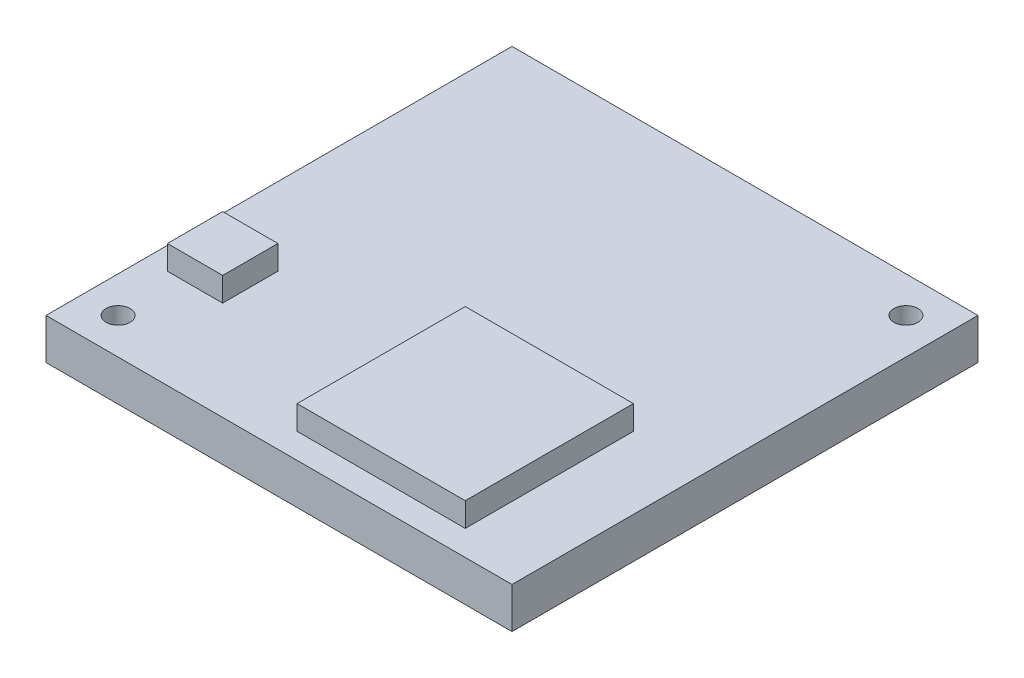
ISO-10303-21;
HEADER;
FILE_DESCRIPTION(('STEP AP214'),'2;1');
FILE_NAME('part.step','',(''),(''),'','','');
FILE_SCHEMA(('AUTOMOTIVE_DESIGN { 1 0 10303 214 1 1 1 1 }'));
ENDSEC;
DATA;
#1=APPLICATION_CONTEXT('core data for automotive mechanical design processes');
#2=APPLICATION_PROTOCOL_DEFINITION('international standard','automotive_design',2000,#1);
#3=PRODUCT_CONTEXT('',#1,'mechanical');
#4=PRODUCT('Part','Part','',(#3));
#5=PRODUCT_RELATED_PRODUCT_CATEGORY('part','',(#4));
#6=PRODUCT_DEFINITION_FORMATION('','',#4);
#7=PRODUCT_DEFINITION_CONTEXT('part definition',#1,'design');
#8=PRODUCT_DEFINITION('design','',#6,#7);
#9=PRODUCT_DEFINITION_SHAPE('','',#8);
#10=(LENGTH_UNIT() NAMED_UNIT(*) SI_UNIT(.MILLI.,.METRE.));
#11=(NAMED_UNIT(*) PLANE_ANGLE_UNIT() SI_UNIT($,.RADIAN.));
#12=(NAMED_UNIT(*) SI_UNIT($,.STERADIAN.) SOLID_ANGLE_UNIT());
#13=UNCERTAINTY_MEASURE_WITH_UNIT(LENGTH_MEASURE(1.E-05),#10,'distance_accuracy_value','');
#14=(GEOMETRIC_REPRESENTATION_CONTEXT(3) GLOBAL_UNCERTAINTY_ASSIGNED_CONTEXT((#13)) GLOBAL_UNIT_ASSIGNED_CONTEXT((#10,
#11,#12)) REPRESENTATION_CONTEXT('',''));
#15=CARTESIAN_POINT('',(0.,0.,0.));
#16=DIRECTION('',(0.,0.,1.));
#17=DIRECTION('',(1.,0.,0.));
#18=AXIS2_PLACEMENT_3D('',#15,#16,#17);
#19=CARTESIAN_POINT('',(0.,1.7,0.));
#20=DIRECTION('',(0.,1.,0.));
#21=DIRECTION('',(0.,0.,1.));
#22=AXIS2_PLACEMENT_3D('',#19,#20,#21);
#23=PLANE('',#22);
#24=DIRECTION('',(0.,0.,-1.));
#25=VECTOR('',#24,1.);
#26=CARTESIAN_POINT('',(6.70606564796416,1.7,1.65194364239327));
#27=LINE('',#26,#25);
#28=CARTESIAN_POINT('',(6.70606564796416,1.7,8.65194364239327));
#29=VERTEX_POINT('',#28);
#30=CARTESIAN_POINT('',(6.70606564796416,1.7,1.65194364239327));
#31=VERTEX_POINT('',#30);
#32=EDGE_CURVE('E58',#29,#31,#27,.T.);
#33=ORIENTED_EDGE('',*,*,#32,.F.);
#34=DIRECTION('',(1.,0.,0.));
#35=VECTOR('',#34,1.);
#36=CARTESIAN_POINT('',(-0.293934352035838,1.7,8.65194364239327));
#37=LINE('',#36,#35);
#38=CARTESIAN_POINT('',(-0.293934352035838,1.7,8.65194364239327));
#39=VERTEX_POINT('',#38);
#40=EDGE_CURVE('E61',#39,#29,#37,.T.);
#41=ORIENTED_EDGE('',*,*,#40,.F.);
#42=DIRECTION('',(0.,0.,1.));
#43=VECTOR('',#42,1.);
#44=CARTESIAN_POINT('',(-0.293934352035839,1.7,1.65194364239327));
#45=LINE('',#44,#43);
#46=CARTESIAN_POINT('',(-0.293934352035839,1.7,1.65194364239327));
#47=VERTEX_POINT('',#46);
#48=EDGE_CURVE('E508',#47,#39,#45,.T.);
#49=ORIENTED_EDGE('',*,*,#48,.F.);
#50=DIRECTION('',(-1.,0.,0.));
#51=VECTOR('',#50,1.);
#52=CARTESIAN_POINT('',(-0.293934352035839,1.7,1.65194364239327));
#53=LINE('',#52,#51);
#54=EDGE_CURVE('E513',#31,#47,#53,.T.);
#55=ORIENTED_EDGE('',*,*,#54,.F.);
#56=EDGE_LOOP('',(#33,#41,#49,#55));
#57=FACE_BOUND('',#56,.T.);
#58=DIRECTION('',(0.,0.,-1.));
#59=VECTOR('',#58,1.);
#60=CARTESIAN_POINT('',(-6.46672243533682,1.7,3.27918895874817));
#61=LINE('',#60,#59);
#62=CARTESIAN_POINT('',(-6.46672243533682,1.7,5.57918895874817));
#63=VERTEX_POINT('',#62);
#64=CARTESIAN_POINT('',(-6.46672243533682,1.7,3.27918895874817));
#65=VERTEX_POINT('',#64);
#66=EDGE_CURVE('E187',#63,#65,#61,.T.);
#67=ORIENTED_EDGE('',*,*,#66,.F.);
#68=DIRECTION('',(1.,0.,0.));
#69=VECTOR('',#68,1.);
#70=CARTESIAN_POINT('',(-8.76672243533682,1.7,5.57918895874817));
#71=LINE('',#70,#69);
#72=CARTESIAN_POINT('',(-8.76672243533682,1.7,5.57918895874817));
#73=VERTEX_POINT('',#72);
#74=EDGE_CURVE('E176',#73,#63,#71,.T.);
#75=ORIENTED_EDGE('',*,*,#74,.F.);
#76=DIRECTION('',(0.,0.,1.));
#77=VECTOR('',#76,1.);
#78=CARTESIAN_POINT('',(-8.76672243533682,1.7,3.27918895874817));
#79=LINE('',#78,#77);
#80=CARTESIAN_POINT('',(-8.76672243533682,1.7,3.27918895874817));
#81=VERTEX_POINT('',#80);
#82=EDGE_CURVE('E178',#81,#73,#79,.T.);
#83=ORIENTED_EDGE('',*,*,#82,.F.);
#84=DIRECTION('',(-1.,0.,0.));
#85=VECTOR('',#84,1.);
#86=CARTESIAN_POINT('',(-8.76672243533682,1.7,3.27918895874817));
#87=LINE('',#86,#85);
#88=EDGE_CURVE('E181',#65,#81,#87,.T.);
#89=ORIENTED_EDGE('',*,*,#88,.F.);
#90=EDGE_LOOP('',(#67,#75,#83,#89));
#91=FACE_BOUND('',#90,.T.);
#92=CARTESIAN_POINT('',(-8.2,1.7,8.20000000000001));
#93=DIRECTION('',(0.,1.,0.));
#94=DIRECTION('',(0.,0.,1.));
#95=AXIS2_PLACEMENT_3D('',#92,#93,#94);
#96=CIRCLE('',#95,0.499999999999999);
#97=CARTESIAN_POINT('',(-8.2,1.7,8.70000000000001));
#98=VERTEX_POINT('',#97);
#99=EDGE_CURVE('E200',#98,#98,#96,.T.);
#100=ORIENTED_EDGE('',*,*,#99,.F.);
#101=EDGE_LOOP('',(#100));
#102=FACE_BOUND('',#101,.T.);
#103=DIRECTION('',(0.,0.,1.));
#104=VECTOR('',#103,1.);
#105=CARTESIAN_POINT('',(-9.7,1.7,9.70000000000004));
#106=LINE('',#105,#104);
#107=CARTESIAN_POINT('',(-9.7,1.7,-9.69999999999996));
#108=VERTEX_POINT('',#107);
#109=CARTESIAN_POINT('',(-9.7,1.7,9.70000000000004));
#110=VERTEX_POINT('',#109);
#111=EDGE_CURVE('E202',#108,#110,#106,.T.);
#112=ORIENTED_EDGE('',*,*,#111,.T.);
#113=DIRECTION('',(1.,0.,0.));
#114=VECTOR('',#113,1.);
#115=CARTESIAN_POINT('',(9.69999999999999,1.7,9.70000000000004));
#116=LINE('',#115,#114);
#117=CARTESIAN_POINT('',(9.69999999999999,1.7,9.70000000000004));
#118=VERTEX_POINT('',#117);
#119=EDGE_CURVE('E208',#110,#118,#116,.T.);
#120=ORIENTED_EDGE('',*,*,#119,.T.);
#121=DIRECTION('',(0.,0.,-1.));
#122=VECTOR('',#121,1.);
#123=CARTESIAN_POINT('',(9.69999999999999,1.7,9.70000000000004));
#124=LINE('',#123,#122);
#125=CARTESIAN_POINT('',(9.69999999999999,1.7,-9.69999999999996));
#126=VERTEX_POINT('',#125);
#127=EDGE_CURVE('E211',#118,#126,#124,.T.);
#128=ORIENTED_EDGE('',*,*,#127,.T.);
#129=DIRECTION('',(-1.,0.,0.));
#130=VECTOR('',#129,1.);
#131=CARTESIAN_POINT('',(9.69999999999999,1.7,-9.69999999999996));
#132=LINE('',#131,#130);
#133=EDGE_CURVE('E213',#126,#108,#132,.T.);
#134=ORIENTED_EDGE('',*,*,#133,.T.);
#135=EDGE_LOOP('',(#112,#120,#128,#134));
#136=FACE_BOUND('',#135,.T.);
#137=CARTESIAN_POINT('',(8.19999999999999,1.7,-8.19999999999999));
#138=DIRECTION('',(0.,1.,0.));
#139=DIRECTION('',(0.,0.,1.));
#140=AXIS2_PLACEMENT_3D('',#137,#138,#139);
#141=CIRCLE('',#140,0.499999999999999);
#142=CARTESIAN_POINT('',(8.19999999999999,1.7,-7.69999999999999));
#143=VERTEX_POINT('',#142);
#144=EDGE_CURVE('E160',#143,#143,#141,.T.);
#145=ORIENTED_EDGE('',*,*,#144,.F.);
#146=EDGE_LOOP('',(#145));
#147=FACE_BOUND('',#146,.T.);
#148=ADVANCED_FACE('F44',(#57,#91,#102,#136,#147),#23,.T.);
#149=CARTESIAN_POINT('',(0.,0.,0.));
#150=DIRECTION('',(0.,1.,0.));
#151=DIRECTION('',(0.,0.,1.));
#152=AXIS2_PLACEMENT_3D('',#149,#150,#151);
#153=PLANE('',#152);
#154=DIRECTION('',(0.,0.,1.));
#155=VECTOR('',#154,1.);
#156=CARTESIAN_POINT('',(-9.7,0.,9.70000000000004));
#157=LINE('',#156,#155);
#158=CARTESIAN_POINT('',(-9.7,0.,-9.69999999999996));
#159=VERTEX_POINT('',#158);
#160=CARTESIAN_POINT('',(-9.7,0.,9.70000000000004));
#161=VERTEX_POINT('',#160);
#162=EDGE_CURVE('E205',#159,#161,#157,.T.);
#163=ORIENTED_EDGE('',*,*,#162,.F.);
#164=DIRECTION('',(-1.,0.,0.));
#165=VECTOR('',#164,1.);
#166=CARTESIAN_POINT('',(9.69999999999999,0.,-9.69999999999996));
#167=LINE('',#166,#165);
#168=CARTESIAN_POINT('',(9.69999999999999,0.,-9.69999999999996));
#169=VERTEX_POINT('',#168);
#170=EDGE_CURVE('E207',#169,#159,#167,.T.);
#171=ORIENTED_EDGE('',*,*,#170,.F.);
#172=DIRECTION('',(0.,0.,-1.));
#173=VECTOR('',#172,1.);
#174=CARTESIAN_POINT('',(9.69999999999999,0.,9.70000000000004));
#175=LINE('',#174,#173);
#176=CARTESIAN_POINT('',(9.69999999999999,0.,9.70000000000004));
#177=VERTEX_POINT('',#176);
#178=EDGE_CURVE('E219',#177,#169,#175,.T.);
#179=ORIENTED_EDGE('',*,*,#178,.F.);
#180=DIRECTION('',(1.,0.,0.));
#181=VECTOR('',#180,1.);
#182=CARTESIAN_POINT('',(9.69999999999999,0.,9.70000000000004));
#183=LINE('',#182,#181);
#184=EDGE_CURVE('E217',#161,#177,#183,.T.);
#185=ORIENTED_EDGE('',*,*,#184,.F.);
#186=EDGE_LOOP('',(#163,#171,#179,#185));
#187=FACE_BOUND('',#186,.T.);
#188=CARTESIAN_POINT('',(-8.2,0.,8.20000000000001));
#189=DIRECTION('',(0.,1.,0.));
#190=DIRECTION('',(0.,0.,1.));
#191=AXIS2_PLACEMENT_3D('',#188,#189,#190);
#192=CIRCLE('',#191,0.499999999999999);
#193=CARTESIAN_POINT('',(-8.2,0.,8.70000000000001));
#194=VERTEX_POINT('',#193);
#195=EDGE_CURVE('E197',#194,#194,#192,.T.);
#196=ORIENTED_EDGE('',*,*,#195,.T.);
#197=EDGE_LOOP('',(#196));
#198=FACE_BOUND('',#197,.T.);
#199=CARTESIAN_POINT('',(8.19999999999999,0.,-8.19999999999999));
#200=DIRECTION('',(0.,1.,0.));
#201=DIRECTION('',(0.,0.,1.));
#202=AXIS2_PLACEMENT_3D('',#199,#200,#201);
#203=CIRCLE('',#202,0.499999999999999);
#204=CARTESIAN_POINT('',(8.19999999999999,0.,-7.69999999999999));
#205=VERTEX_POINT('',#204);
#206=EDGE_CURVE('E152',#205,#205,#203,.T.);
#207=ORIENTED_EDGE('',*,*,#206,.T.);
#208=EDGE_LOOP('',(#207));
#209=FACE_BOUND('',#208,.T.);
#210=ADVANCED_FACE('F236',(#187,#198,#209),#153,.F.);
#211=CARTESIAN_POINT('',(-9.7,1.7,9.70000000000004));
#212=DIRECTION('',(1.,0.,0.));
#213=DIRECTION('',(0.,0.,-1.));
#214=AXIS2_PLACEMENT_3D('',#211,#212,#213);
#215=PLANE('',#214);
#216=ORIENTED_EDGE('',*,*,#162,.T.);
#217=DIRECTION('',(0.,-1.,0.));
#218=VECTOR('',#217,1.);
#219=CARTESIAN_POINT('',(-9.7,1.7,9.70000000000004));
#220=LINE('',#219,#218);
#221=EDGE_CURVE('E11',#110,#161,#220,.T.);
#222=ORIENTED_EDGE('',*,*,#221,.F.);
#223=ORIENTED_EDGE('',*,*,#111,.F.);
#224=DIRECTION('',(0.,-1.,0.));
#225=VECTOR('',#224,1.);
#226=CARTESIAN_POINT('',(-9.7,1.7,-9.69999999999996));
#227=LINE('',#226,#225);
#228=EDGE_CURVE('E214',#108,#159,#227,.T.);
#229=ORIENTED_EDGE('',*,*,#228,.T.);
#230=EDGE_LOOP('',(#216,#222,#223,#229));
#231=FACE_BOUND('',#230,.T.);
#232=ADVANCED_FACE('F50',(#231),#215,.F.);
#233=CARTESIAN_POINT('',(9.69999999999999,1.7,9.70000000000004));
#234=DIRECTION('',(0.,0.,-1.));
#235=DIRECTION('',(-1.,0.,0.));
#236=AXIS2_PLACEMENT_3D('',#233,#234,#235);
#237=PLANE('',#236);
#238=ORIENTED_EDGE('',*,*,#184,.T.);
#239=DIRECTION('',(0.,-1.,0.));
#240=VECTOR('',#239,1.);
#241=CARTESIAN_POINT('',(9.69999999999999,1.7,9.70000000000004));
#242=LINE('',#241,#240);
#243=EDGE_CURVE('E52',#118,#177,#242,.T.);
#244=ORIENTED_EDGE('',*,*,#243,.F.);
#245=ORIENTED_EDGE('',*,*,#119,.F.);
#246=ORIENTED_EDGE('',*,*,#221,.T.);
#247=EDGE_LOOP('',(#238,#244,#245,#246));
#248=FACE_BOUND('',#247,.T.);
#249=ADVANCED_FACE('F248',(#248),#237,.F.);
#250=CARTESIAN_POINT('',(9.69999999999999,1.7,9.70000000000004));
#251=DIRECTION('',(-1.,0.,0.));
#252=DIRECTION('',(0.,0.,1.));
#253=AXIS2_PLACEMENT_3D('',#250,#251,#252);
#254=PLANE('',#253);
#255=ORIENTED_EDGE('',*,*,#178,.T.);
#256=DIRECTION('',(0.,-1.,0.));
#257=VECTOR('',#256,1.);
#258=CARTESIAN_POINT('',(9.69999999999999,1.7,-9.69999999999996));
#259=LINE('',#258,#257);
#260=EDGE_CURVE('E223',#126,#169,#259,.T.);
#261=ORIENTED_EDGE('',*,*,#260,.F.);
#262=ORIENTED_EDGE('',*,*,#127,.F.);
#263=ORIENTED_EDGE('',*,*,#243,.T.);
#264=EDGE_LOOP('',(#255,#261,#262,#263));
#265=FACE_BOUND('',#264,.T.);
#266=ADVANCED_FACE('F232',(#265),#254,.F.);
#267=CARTESIAN_POINT('',(9.69999999999999,1.7,-9.69999999999996));
#268=DIRECTION('',(0.,0.,1.));
#269=DIRECTION('',(1.,0.,0.));
#270=AXIS2_PLACEMENT_3D('',#267,#268,#269);
#271=PLANE('',#270);
#272=ORIENTED_EDGE('',*,*,#170,.T.);
#273=ORIENTED_EDGE('',*,*,#228,.F.);
#274=ORIENTED_EDGE('',*,*,#133,.F.);
#275=ORIENTED_EDGE('',*,*,#260,.T.);
#276=EDGE_LOOP('',(#272,#273,#274,#275));
#277=FACE_BOUND('',#276,.T.);
#278=ADVANCED_FACE('F245',(#277),#271,.F.);
#279=CARTESIAN_POINT('',(-8.2,1.7,8.20000000000001));
#280=DIRECTION('',(0.,-1.,0.));
#281=DIRECTION('',(0.,0.,-1.));
#282=AXIS2_PLACEMENT_3D('',#279,#280,#281);
#283=CYLINDRICAL_SURFACE('',#282,0.499999999999999);
#284=ORIENTED_EDGE('',*,*,#99,.T.);
#285=EDGE_LOOP('',(#284));
#286=FACE_BOUND('',#285,.T.);
#287=ORIENTED_EDGE('',*,*,#195,.F.);
#288=EDGE_LOOP('',(#287));
#289=FACE_BOUND('',#288,.T.);
#290=ADVANCED_FACE('F262',(#286,#289),#283,.F.);
#291=CARTESIAN_POINT('',(8.19999999999999,1.7,-8.19999999999999));
#292=DIRECTION('',(0.,-1.,0.));
#293=DIRECTION('',(0.,0.,-1.));
#294=AXIS2_PLACEMENT_3D('',#291,#292,#293);
#295=CYLINDRICAL_SURFACE('',#294,0.499999999999999);
#296=ORIENTED_EDGE('',*,*,#144,.T.);
#297=EDGE_LOOP('',(#296));
#298=FACE_BOUND('',#297,.T.);
#299=ORIENTED_EDGE('',*,*,#206,.F.);
#300=EDGE_LOOP('',(#299));
#301=FACE_BOUND('',#300,.T.);
#302=ADVANCED_FACE('F271',(#298,#301),#295,.F.);
#303=CARTESIAN_POINT('',(-6.46672243533682,2.7,3.27918895874817));
#304=DIRECTION('',(-1.,0.,0.));
#305=DIRECTION('',(0.,0.,1.));
#306=AXIS2_PLACEMENT_3D('',#303,#304,#305);
#307=PLANE('',#306);
#308=ORIENTED_EDGE('',*,*,#66,.T.);
#309=DIRECTION('',(0.,-1.,0.));
#310=VECTOR('',#309,1.);
#311=CARTESIAN_POINT('',(-6.46672243533682,2.7,3.27918895874817));
#312=LINE('',#311,#310);
#313=CARTESIAN_POINT('',(-6.46672243533682,2.7,3.27918895874817));
#314=VERTEX_POINT('',#313);
#315=EDGE_CURVE('E162',#314,#65,#312,.T.);
#316=ORIENTED_EDGE('',*,*,#315,.F.);
#317=DIRECTION('',(0.,0.,-1.));
#318=VECTOR('',#317,1.);
#319=CARTESIAN_POINT('',(-6.46672243533682,2.7,3.27918895874817));
#320=LINE('',#319,#318);
#321=CARTESIAN_POINT('',(-6.46672243533682,2.7,5.57918895874817));
#322=VERTEX_POINT('',#321);
#323=EDGE_CURVE('E180',#322,#314,#320,.T.);
#324=ORIENTED_EDGE('',*,*,#323,.F.);
#325=DIRECTION('',(0.,-1.,0.));
#326=VECTOR('',#325,1.);
#327=CARTESIAN_POINT('',(-6.46672243533682,2.7,5.57918895874817));
#328=LINE('',#327,#326);
#329=EDGE_CURVE('E175',#322,#63,#328,.T.);
#330=ORIENTED_EDGE('',*,*,#329,.T.);
#331=EDGE_LOOP('',(#308,#316,#324,#330));
#332=FACE_BOUND('',#331,.T.);
#333=ADVANCED_FACE('F277',(#332),#307,.F.);
#334=CARTESIAN_POINT('',(-8.76672243533682,2.7,3.27918895874817));
#335=DIRECTION('',(0.,0.,1.));
#336=DIRECTION('',(1.,0.,0.));
#337=AXIS2_PLACEMENT_3D('',#334,#335,#336);
#338=PLANE('',#337);
#339=ORIENTED_EDGE('',*,*,#88,.T.);
#340=DIRECTION('',(0.,-1.,0.));
#341=VECTOR('',#340,1.);
#342=CARTESIAN_POINT('',(-8.76672243533682,2.7,3.27918895874817));
#343=LINE('',#342,#341);
#344=CARTESIAN_POINT('',(-8.76672243533682,2.7,3.27918895874817));
#345=VERTEX_POINT('',#344);
#346=EDGE_CURVE('E167',#345,#81,#343,.T.);
#347=ORIENTED_EDGE('',*,*,#346,.F.);
#348=DIRECTION('',(-1.,0.,0.));
#349=VECTOR('',#348,1.);
#350=CARTESIAN_POINT('',(-8.76672243533682,2.7,3.27918895874817));
#351=LINE('',#350,#349);
#352=EDGE_CURVE('E192',#314,#345,#351,.T.);
#353=ORIENTED_EDGE('',*,*,#352,.F.);
#354=ORIENTED_EDGE('',*,*,#315,.T.);
#355=EDGE_LOOP('',(#339,#347,#353,#354));
#356=FACE_BOUND('',#355,.T.);
#357=ADVANCED_FACE('F289',(#356),#338,.F.);
#358=CARTESIAN_POINT('',(-8.76672243533682,2.7,3.27918895874817));
#359=DIRECTION('',(1.,0.,0.));
#360=DIRECTION('',(0.,0.,-1.));
#361=AXIS2_PLACEMENT_3D('',#358,#359,#360);
#362=PLANE('',#361);
#363=ORIENTED_EDGE('',*,*,#82,.T.);
#364=DIRECTION('',(0.,-1.,0.));
#365=VECTOR('',#364,1.);
#366=CARTESIAN_POINT('',(-8.76672243533682,2.7,5.57918895874817));
#367=LINE('',#366,#365);
#368=CARTESIAN_POINT('',(-8.76672243533682,2.7,5.57918895874817));
#369=VERTEX_POINT('',#368);
#370=EDGE_CURVE('E166',#369,#73,#367,.T.);
#371=ORIENTED_EDGE('',*,*,#370,.F.);
#372=DIRECTION('',(0.,0.,1.));
#373=VECTOR('',#372,1.);
#374=CARTESIAN_POINT('',(-8.76672243533682,2.7,3.27918895874817));
#375=LINE('',#374,#373);
#376=EDGE_CURVE('E188',#345,#369,#375,.T.);
#377=ORIENTED_EDGE('',*,*,#376,.F.);
#378=ORIENTED_EDGE('',*,*,#346,.T.);
#379=EDGE_LOOP('',(#363,#371,#377,#378));
#380=FACE_BOUND('',#379,.T.);
#381=ADVANCED_FACE('F296',(#380),#362,.F.);
#382=CARTESIAN_POINT('',(-8.76672243533682,2.7,5.57918895874817));
#383=DIRECTION('',(0.,0.,-1.));
#384=DIRECTION('',(-1.,0.,0.));
#385=AXIS2_PLACEMENT_3D('',#382,#383,#384);
#386=PLANE('',#385);
#387=ORIENTED_EDGE('',*,*,#74,.T.);
#388=ORIENTED_EDGE('',*,*,#329,.F.);
#389=DIRECTION('',(1.,0.,0.));
#390=VECTOR('',#389,1.);
#391=CARTESIAN_POINT('',(-8.76672243533682,2.7,5.57918895874817));
#392=LINE('',#391,#390);
#393=EDGE_CURVE('E173',#369,#322,#392,.T.);
#394=ORIENTED_EDGE('',*,*,#393,.F.);
#395=ORIENTED_EDGE('',*,*,#370,.T.);
#396=EDGE_LOOP('',(#387,#388,#394,#395));
#397=FACE_BOUND('',#396,.T.);
#398=ADVANCED_FACE('F293',(#397),#386,.F.);
#399=CARTESIAN_POINT('',(0.,2.7,0.));
#400=DIRECTION('',(0.,1.,0.));
#401=DIRECTION('',(0.,0.,1.));
#402=AXIS2_PLACEMENT_3D('',#399,#400,#401);
#403=PLANE('',#402);
#404=ORIENTED_EDGE('',*,*,#323,.T.);
#405=ORIENTED_EDGE('',*,*,#352,.T.);
#406=ORIENTED_EDGE('',*,*,#376,.T.);
#407=ORIENTED_EDGE('',*,*,#393,.T.);
#408=EDGE_LOOP('',(#404,#405,#406,#407));
#409=FACE_BOUND('',#408,.T.);
#410=ADVANCED_FACE('F295',(#409),#403,.T.);
#411=CARTESIAN_POINT('',(6.70606564796416,2.7,1.65194364239327));
#412=DIRECTION('',(-1.,0.,0.));
#413=DIRECTION('',(0.,0.,1.));
#414=AXIS2_PLACEMENT_3D('',#411,#412,#413);
#415=PLANE('',#414);
#416=ORIENTED_EDGE('',*,*,#32,.T.);
#417=DIRECTION('',(0.,-1.,0.));
#418=VECTOR('',#417,1.);
#419=CARTESIAN_POINT('',(6.70606564796416,2.7,1.65194364239327));
#420=LINE('',#419,#418);
#421=CARTESIAN_POINT('',(6.70606564796416,2.7,1.65194364239327));
#422=VERTEX_POINT('',#421);
#423=EDGE_CURVE('E137',#422,#31,#420,.T.);
#424=ORIENTED_EDGE('',*,*,#423,.F.);
#425=DIRECTION('',(0.,0.,-1.));
#426=VECTOR('',#425,1.);
#427=CARTESIAN_POINT('',(6.70606564796416,2.7,1.65194364239327));
#428=LINE('',#427,#426);
#429=CARTESIAN_POINT('',(6.70606564796416,2.7,8.65194364239327));
#430=VERTEX_POINT('',#429);
#431=EDGE_CURVE('E141',#430,#422,#428,.T.);
#432=ORIENTED_EDGE('',*,*,#431,.F.);
#433=DIRECTION('',(0.,-1.,0.));
#434=VECTOR('',#433,1.);
#435=CARTESIAN_POINT('',(6.70606564796416,2.7,8.65194364239327));
#436=LINE('',#435,#434);
#437=EDGE_CURVE('E507',#430,#29,#436,.T.);
#438=ORIENTED_EDGE('',*,*,#437,.T.);
#439=EDGE_LOOP('',(#416,#424,#432,#438));
#440=FACE_BOUND('',#439,.T.);
#441=ADVANCED_FACE('F153',(#440),#415,.F.);
#442=CARTESIAN_POINT('',(-0.293934352035839,2.7,1.65194364239327));
#443=DIRECTION('',(0.,0.,1.));
#444=DIRECTION('',(1.,0.,0.));
#445=AXIS2_PLACEMENT_3D('',#442,#443,#444);
#446=PLANE('',#445);
#447=ORIENTED_EDGE('',*,*,#54,.T.);
#448=DIRECTION('',(0.,-1.,0.));
#449=VECTOR('',#448,1.);
#450=CARTESIAN_POINT('',(-0.293934352035839,2.7,1.65194364239327));
#451=LINE('',#450,#449);
#452=CARTESIAN_POINT('',(-0.293934352035839,2.7,1.65194364239327));
#453=VERTEX_POINT('',#452);
#454=EDGE_CURVE('E138',#453,#47,#451,.T.);
#455=ORIENTED_EDGE('',*,*,#454,.F.);
#456=DIRECTION('',(-1.,0.,0.));
#457=VECTOR('',#456,1.);
#458=CARTESIAN_POINT('',(-0.293934352035839,2.7,1.65194364239327));
#459=LINE('',#458,#457);
#460=EDGE_CURVE('E135',#422,#453,#459,.T.);
#461=ORIENTED_EDGE('',*,*,#460,.F.);
#462=ORIENTED_EDGE('',*,*,#423,.T.);
#463=EDGE_LOOP('',(#447,#455,#461,#462));
#464=FACE_BOUND('',#463,.T.);
#465=ADVANCED_FACE('F133',(#464),#446,.F.);
#466=CARTESIAN_POINT('',(-0.293934352035839,2.7,1.65194364239327));
#467=DIRECTION('',(1.,0.,0.));
#468=DIRECTION('',(0.,0.,-1.));
#469=AXIS2_PLACEMENT_3D('',#466,#467,#468);
#470=PLANE('',#469);
#471=ORIENTED_EDGE('',*,*,#48,.T.);
#472=DIRECTION('',(0.,-1.,0.));
#473=VECTOR('',#472,1.);
#474=CARTESIAN_POINT('',(-0.293934352035838,2.7,8.65194364239327));
#475=LINE('',#474,#473);
#476=CARTESIAN_POINT('',(-0.293934352035838,2.7,8.65194364239327));
#477=VERTEX_POINT('',#476);
#478=EDGE_CURVE('E157',#477,#39,#475,.T.);
#479=ORIENTED_EDGE('',*,*,#478,.F.);
#480=DIRECTION('',(0.,0.,1.));
#481=VECTOR('',#480,1.);
#482=CARTESIAN_POINT('',(-0.293934352035839,2.7,1.65194364239327));
#483=LINE('',#482,#481);
#484=EDGE_CURVE('E142',#453,#477,#483,.T.);
#485=ORIENTED_EDGE('',*,*,#484,.F.);
#486=ORIENTED_EDGE('',*,*,#454,.T.);
#487=EDGE_LOOP('',(#471,#479,#485,#486));
#488=FACE_BOUND('',#487,.T.);
#489=ADVANCED_FACE('F313',(#488),#470,.F.);
#490=CARTESIAN_POINT('',(-0.293934352035838,2.7,8.65194364239327));
#491=DIRECTION('',(0.,0.,-1.));
#492=DIRECTION('',(-1.,0.,0.));
#493=AXIS2_PLACEMENT_3D('',#490,#491,#492);
#494=PLANE('',#493);
#495=ORIENTED_EDGE('',*,*,#40,.T.);
#496=ORIENTED_EDGE('',*,*,#437,.F.);
#497=DIRECTION('',(1.,0.,0.));
#498=VECTOR('',#497,1.);
#499=CARTESIAN_POINT('',(-0.293934352035838,2.7,8.65194364239327));
#500=LINE('',#499,#498);
#501=EDGE_CURVE('E146',#477,#430,#500,.T.);
#502=ORIENTED_EDGE('',*,*,#501,.F.);
#503=ORIENTED_EDGE('',*,*,#478,.T.);
#504=EDGE_LOOP('',(#495,#496,#502,#503));
#505=FACE_BOUND('',#504,.T.);
#506=ADVANCED_FACE('F314',(#505),#494,.F.);
#507=CARTESIAN_POINT('',(0.,2.7,0.));
#508=DIRECTION('',(0.,1.,0.));
#509=DIRECTION('',(0.,0.,1.));
#510=AXIS2_PLACEMENT_3D('',#507,#508,#509);
#511=PLANE('',#510);
#512=ORIENTED_EDGE('',*,*,#431,.T.);
#513=ORIENTED_EDGE('',*,*,#460,.T.);
#514=ORIENTED_EDGE('',*,*,#484,.T.);
#515=ORIENTED_EDGE('',*,*,#501,.T.);
#516=EDGE_LOOP('',(#512,#513,#514,#515));
#517=FACE_BOUND('',#516,.T.);
#518=ADVANCED_FACE('F148',(#517),#511,.T.);
#519=CLOSED_SHELL('',(#148,#210,#232,#249,#266,#278,#290,#302,#333,#357,#381,#398,#410,#441,
#465,#489,#506,#518));
#520=MANIFOLD_SOLID_BREP('B2',#519);
#521=ADVANCED_BREP_SHAPE_REPRESENTATION('',(#18,#520),#14);
#522=SHAPE_DEFINITION_REPRESENTATION(#9,#521);
ENDSEC;
END-ISO-10303-21;
